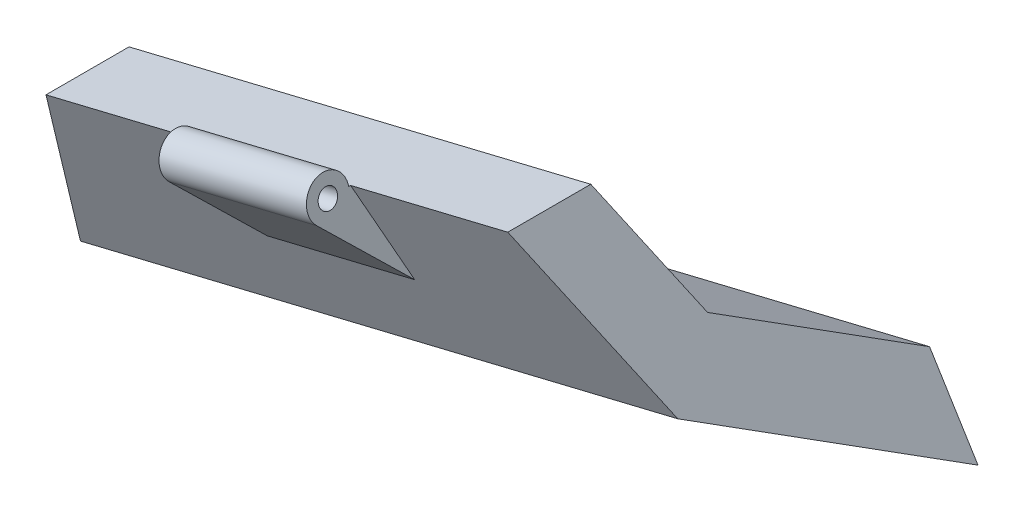
ISO-10303-21;
HEADER;
FILE_DESCRIPTION(('STEP AP214'),'2;1');
FILE_NAME('part.step','',(''),(''),'','','');
FILE_SCHEMA(('AUTOMOTIVE_DESIGN { 1 0 10303 214 1 1 1 1 }'));
ENDSEC;
DATA;
#1=APPLICATION_CONTEXT('core data for automotive mechanical design processes');
#2=APPLICATION_PROTOCOL_DEFINITION('international standard','automotive_design',2000,#1);
#3=PRODUCT_CONTEXT('',#1,'mechanical');
#4=PRODUCT('Part','Part','',(#3));
#5=PRODUCT_RELATED_PRODUCT_CATEGORY('part','',(#4));
#6=PRODUCT_DEFINITION_FORMATION('','',#4);
#7=PRODUCT_DEFINITION_CONTEXT('part definition',#1,'design');
#8=PRODUCT_DEFINITION('design','',#6,#7);
#9=PRODUCT_DEFINITION_SHAPE('','',#8);
#10=(LENGTH_UNIT() NAMED_UNIT(*) SI_UNIT(.MILLI.,.METRE.));
#11=(NAMED_UNIT(*) PLANE_ANGLE_UNIT() SI_UNIT($,.RADIAN.));
#12=(NAMED_UNIT(*) SI_UNIT($,.STERADIAN.) SOLID_ANGLE_UNIT());
#13=UNCERTAINTY_MEASURE_WITH_UNIT(LENGTH_MEASURE(1.E-05),#10,'distance_accuracy_value','');
#14=(GEOMETRIC_REPRESENTATION_CONTEXT(3) GLOBAL_UNCERTAINTY_ASSIGNED_CONTEXT((#13)) GLOBAL_UNIT_ASSIGNED_CONTEXT((#10,
#11,#12)) REPRESENTATION_CONTEXT('',''));
#15=CARTESIAN_POINT('',(0.,0.,0.));
#16=DIRECTION('',(0.,0.,1.));
#17=DIRECTION('',(1.,0.,0.));
#18=AXIS2_PLACEMENT_3D('',#15,#16,#17);
#19=CARTESIAN_POINT('',(348.988907895351,-99.5064339704242,30.));
#20=DIRECTION('',(0.0957973074488384,-0.39529428620475,0.913545457642601));
#21=DIRECTION('',(-0.2151642753711,0.887845503330089,0.406736643075799));
#22=AXIS2_PLACEMENT_3D('',#19,#20,#21);
#23=PLANE('',#22);
#24=DIRECTION('',(-0.2151642753711,0.88784550333009,0.406736643075798));
#25=VECTOR('',#24,1.);
#26=CARTESIAN_POINT('',(367.352521584004,47.1024045626833,91.5124851891419));
#27=LINE('',#26,#25);
#28=CARTESIAN_POINT('',(397.527444009768,-77.4102225583484,34.4712006573125));
#29=VERTEX_POINT('',#28);
#30=CARTESIAN_POINT('',(394.602701121481,-65.3416771769953,40.));
#31=VERTEX_POINT('',#30);
#32=EDGE_CURVE('E143',#29,#31,#27,.T.);
#33=ORIENTED_EDGE('',*,*,#32,.F.);
#34=DIRECTION('',(0.971867897653577,0.23552662165967,0.));
#35=VECTOR('',#34,1.);
#36=CARTESIAN_POINT('',(378.090086056696,-82.1207549915418,34.4712006573125));
#37=LINE('',#36,#35);
#38=CARTESIAN_POINT('',(378.090086056696,-82.1207549915418,34.4712006573125));
#39=VERTEX_POINT('',#38);
#40=EDGE_CURVE('E162',#39,#29,#37,.T.);
#41=ORIENTED_EDGE('',*,*,#40,.F.);
#42=DIRECTION('',(-0.2151642753711,0.88784550333009,0.406736643075798));
#43=VECTOR('',#42,1.);
#44=CARTESIAN_POINT('',(347.915163630932,42.3918721294899,91.5124851891419));
#45=LINE('',#44,#43);
#46=CARTESIAN_POINT('',(375.165343168409,-70.0522096101887,40.));
#47=VERTEX_POINT('',#46);
#48=EDGE_CURVE('E160',#39,#47,#45,.T.);
#49=ORIENTED_EDGE('',*,*,#48,.T.);
#50=DIRECTION('',(-0.971867897653576,-0.235526621659671,0.));
#51=VECTOR('',#50,1.);
#52=CARTESIAN_POINT('',(405.380934216758,-62.7296340850072,40.));
#53=LINE('',#52,#51);
#54=CARTESIAN_POINT('',(354.443708943028,-75.0739790462969,40.));
#55=VERTEX_POINT('',#54);
#56=EDGE_CURVE('E63',#55,#47,#53,.F.);
#57=ORIENTED_EDGE('',*,*,#56,.F.);
#58=DIRECTION('',(-0.202349167688116,-0.906336798585831,-0.370956091559517));
#59=VECTOR('',#58,1.);
#60=CARTESIAN_POINT('',(348.988907895351,-99.5064339704242,30.));
#61=LINE('',#60,#59);
#62=CARTESIAN_POINT('',(348.988907895351,-99.5064339704242,30.));
#63=VERTEX_POINT('',#62);
#64=EDGE_CURVE('E172',#55,#63,#61,.T.);
#65=ORIENTED_EDGE('',*,*,#64,.T.);
#66=DIRECTION('',(-0.971867897653576,-0.235526621659671,0.));
#67=VECTOR('',#66,1.);
#68=CARTESIAN_POINT('',(433.239967620562,-79.0886719307119,30.));
#69=LINE('',#68,#67);
#70=CARTESIAN_POINT('',(427.7428007149,-80.4208788624522,30.));
#71=VERTEX_POINT('',#70);
#72=EDGE_CURVE('E181',#63,#71,#69,.F.);
#73=ORIENTED_EDGE('',*,*,#72,.T.);
#74=DIRECTION('',(0.484023872949946,-0.78345831018347,-0.389761422692135));
#75=VECTOR('',#74,1.);
#76=CARTESIAN_POINT('',(427.7428007149,-80.4208788624522,30.));
#77=LINE('',#76,#75);
#78=CARTESIAN_POINT('',(415.324335346862,-60.3199077408872,40.));
#79=VERTEX_POINT('',#78);
#80=EDGE_CURVE('E169',#79,#71,#77,.T.);
#81=ORIENTED_EDGE('',*,*,#80,.F.);
#82=EDGE_CURVE('E171',#31,#79,#53,.F.);
#83=ORIENTED_EDGE('',*,*,#82,.F.);
#84=EDGE_LOOP('',(#33,#41,#49,#57,#65,#73,#81,#83));
#85=FACE_BOUND('',#84,.T.);
#86=ADVANCED_FACE('F41',(#85),#23,.T.);
#87=CARTESIAN_POINT('',(354.443708943028,-75.0739790462969,-0.0100000000000031));
#88=DIRECTION('',(0.235526621659671,-0.971867897653576,0.));
#89=DIRECTION('',(0.971867897653576,0.235526621659671,0.));
#90=AXIS2_PLACEMENT_3D('',#87,#88,#89);
#91=PLANE('',#90);
#92=DIRECTION('',(0.971867897653576,0.235526621659671,0.));
#93=VECTOR('',#92,1.);
#94=CARTESIAN_POINT('',(343.69889336054,-77.677923595355,29.0536372149395));
#95=LINE('',#94,#93);
#96=CARTESIAN_POINT('',(415.324335346862,-60.3199077408872,29.0536372149395));
#97=VERTEX_POINT('',#96);
#98=CARTESIAN_POINT('',(354.443708943028,-75.0739790462969,29.0536372149395));
#99=VERTEX_POINT('',#98);
#100=EDGE_CURVE('E199',#97,#99,#95,.F.);
#101=ORIENTED_EDGE('',*,*,#100,.T.);
#102=DIRECTION('',(0.,0.,1.));
#103=VECTOR('',#102,1.);
#104=CARTESIAN_POINT('',(354.443708943028,-75.0739790462969,-0.0100000000000031));
#105=LINE('',#104,#103);
#106=EDGE_CURVE('E49',#99,#55,#105,.T.);
#107=ORIENTED_EDGE('',*,*,#106,.T.);
#108=ORIENTED_EDGE('',*,*,#56,.T.);
#109=DIRECTION('',(0.,0.,1.));
#110=VECTOR('',#109,1.);
#111=CARTESIAN_POINT('',(375.165343168409,-70.0522096101887,-2.98188135074108E-13));
#112=LINE('',#111,#110);
#113=CARTESIAN_POINT('',(375.165343168409,-70.0522096101887,40.25));
#114=VERTEX_POINT('',#113);
#115=EDGE_CURVE('E59',#47,#114,#112,.T.);
#116=ORIENTED_EDGE('',*,*,#115,.T.);
#117=DIRECTION('',(0.971867897653577,0.23552662165967,0.));
#118=VECTOR('',#117,1.);
#119=CARTESIAN_POINT('',(375.165343168409,-70.0522096101887,40.25));
#120=LINE('',#119,#118);
#121=CARTESIAN_POINT('',(394.602701121481,-65.3416771769953,40.25));
#122=VERTEX_POINT('',#121);
#123=EDGE_CURVE('E123',#114,#122,#120,.T.);
#124=ORIENTED_EDGE('',*,*,#123,.T.);
#125=DIRECTION('',(0.,0.,1.));
#126=VECTOR('',#125,1.);
#127=CARTESIAN_POINT('',(394.602701121481,-65.3416771769953,-2.98188135074108E-13));
#128=LINE('',#127,#126);
#129=EDGE_CURVE('E124',#31,#122,#128,.T.);
#130=ORIENTED_EDGE('',*,*,#129,.F.);
#131=ORIENTED_EDGE('',*,*,#82,.T.);
#132=DIRECTION('',(0.,0.,1.));
#133=VECTOR('',#132,1.);
#134=CARTESIAN_POINT('',(415.324335346862,-60.3199077408872,-0.0100000000000031));
#135=LINE('',#134,#133);
#136=EDGE_CURVE('E11',#97,#79,#135,.T.);
#137=ORIENTED_EDGE('',*,*,#136,.F.);
#138=EDGE_LOOP('',(#101,#107,#108,#116,#124,#130,#131,#137));
#139=FACE_BOUND('',#138,.T.);
#140=ADVANCED_FACE('F121',(#139),#91,.F.);
#141=CARTESIAN_POINT('',(415.324335346862,-60.3199077408872,-0.0100000000000031));
#142=DIRECTION('',(-0.850738203766929,-0.52558967707844,0.));
#143=DIRECTION('',(0.52558967707844,-0.850738203766929,0.));
#144=AXIS2_PLACEMENT_3D('',#141,#142,#143);
#145=PLANE('',#144);
#146=DIRECTION('',(0.272839638851336,-0.441627974055819,-0.854706536773193));
#147=VECTOR('',#146,1.);
#148=CARTESIAN_POINT('',(429.61081277159,-83.444509825978,4.14820323635418));
#149=LINE('',#148,#147);
#150=CARTESIAN_POINT('',(423.852746647789,-74.124298556678,22.1861128887238));
#151=VERTEX_POINT('',#150);
#152=CARTESIAN_POINT('',(430.935003267619,-85.5878918084759,0.));
#153=VERTEX_POINT('',#152);
#154=EDGE_CURVE('E184',#151,#153,#149,.T.);
#155=ORIENTED_EDGE('',*,*,#154,.F.);
#156=DIRECTION('',(0.484023872949946,-0.78345831018347,-0.389761422692135));
#157=VECTOR('',#156,1.);
#158=CARTESIAN_POINT('',(425.67772741439,-77.0782775387581,20.7165426056686));
#159=LINE('',#158,#157);
#160=EDGE_CURVE('E192',#97,#151,#159,.T.);
#161=ORIENTED_EDGE('',*,*,#160,.F.);
#162=ORIENTED_EDGE('',*,*,#136,.T.);
#163=ORIENTED_EDGE('',*,*,#80,.T.);
#164=DIRECTION('',(0.272839638851336,-0.441627974055819,-0.854706536773193));
#165=VECTOR('',#164,1.);
#166=CARTESIAN_POINT('',(434.274769227932,-90.9937561509262,9.53773795629766));
#167=LINE('',#166,#165);
#168=CARTESIAN_POINT('',(437.319408373058,-95.9219177005234,0.));
#169=VERTEX_POINT('',#168);
#170=EDGE_CURVE('E174',#71,#169,#167,.T.);
#171=ORIENTED_EDGE('',*,*,#170,.T.);
#172=DIRECTION('',(0.52558967707844,-0.850738203766929,0.));
#173=VECTOR('',#172,1.);
#174=CARTESIAN_POINT('',(381.406613666847,-5.41947328350372,0.));
#175=LINE('',#174,#173);
#176=EDGE_CURVE('E166',#153,#169,#175,.T.);
#177=ORIENTED_EDGE('',*,*,#176,.F.);
#178=EDGE_LOOP('',(#155,#161,#162,#163,#171,#177));
#179=FACE_BOUND('',#178,.T.);
#180=ADVANCED_FACE('F222',(#179),#145,.F.);
#181=CARTESIAN_POINT('',(344.782390589165,-118.347734243823,-0.0100000000000031));
#182=DIRECTION('',(0.975972004001197,-0.217895955460141,0.));
#183=DIRECTION('',(0.217895955460141,0.975972004001197,0.));
#184=AXIS2_PLACEMENT_3D('',#181,#182,#183);
#185=PLANE('',#184);
#186=DIRECTION('',(-0.117912940333481,-0.528140728596464,-0.840930383146851));
#187=VECTOR('',#186,1.);
#188=CARTESIAN_POINT('',(347.465534795954,-106.329734079507,19.135622260557));
#189=LINE('',#188,#187);
#190=CARTESIAN_POINT('',(344.782390589165,-118.347734243823,0.));
#191=VERTEX_POINT('',#190);
#192=EDGE_CURVE('E185',#63,#191,#189,.T.);
#193=ORIENTED_EDGE('',*,*,#192,.F.);
#194=ORIENTED_EDGE('',*,*,#64,.F.);
#195=ORIENTED_EDGE('',*,*,#106,.F.);
#196=DIRECTION('',(-0.202349167688116,-0.906336798585831,-0.370956091559517));
#197=VECTOR('',#196,1.);
#198=CARTESIAN_POINT('',(349.810570963652,-95.8261446796476,20.5599489229547));
#199=LINE('',#198,#197);
#200=CARTESIAN_POINT('',(350.697611054069,-91.8530269003582,22.1861128887238));
#201=VERTEX_POINT('',#200);
#202=EDGE_CURVE('E191',#99,#201,#199,.T.);
#203=ORIENTED_EDGE('',*,*,#202,.T.);
#204=DIRECTION('',(-0.117912940333481,-0.528140728596464,-0.840930383146851));
#205=VECTOR('',#204,1.);
#206=CARTESIAN_POINT('',(349.448666277806,-97.4471423744249,13.2789004465472));
#207=LINE('',#206,#205);
#208=CARTESIAN_POINT('',(347.586735459956,-105.78686739489,0.));
#209=VERTEX_POINT('',#208);
#210=EDGE_CURVE('E187',#201,#209,#207,.T.);
#211=ORIENTED_EDGE('',*,*,#210,.T.);
#212=DIRECTION('',(0.217895955460141,0.975972004001197,0.));
#213=VECTOR('',#212,1.);
#214=CARTESIAN_POINT('',(372.10561997367,4.0350189461836,0.));
#215=LINE('',#214,#213);
#216=EDGE_CURVE('E44',#191,#209,#215,.T.);
#217=ORIENTED_EDGE('',*,*,#216,.F.);
#218=EDGE_LOOP('',(#193,#194,#195,#203,#211,#217));
#219=FACE_BOUND('',#218,.T.);
#220=ADVANCED_FACE('F43',(#219),#185,.F.);
#221=CARTESIAN_POINT('',(390.17876648423,0.,0.));
#222=DIRECTION('',(0.,0.,1.));
#223=DIRECTION('',(1.,0.,0.));
#224=AXIS2_PLACEMENT_3D('',#221,#222,#223);
#225=PLANE('',#224);
#226=CARTESIAN_POINT('',(389.873266372813,-102.275486483905,0.));
#227=DIRECTION('',(0.,0.,1.));
#228=DIRECTION('',(1.,0.,0.));
#229=AXIS2_PLACEMENT_3D('',#226,#227,#228);
#230=CIRCLE('',#229,3.00000000000001);
#231=CARTESIAN_POINT('',(392.873266372813,-102.275486483905,0.));
#232=VERTEX_POINT('',#231);
#233=EDGE_CURVE('E163',#232,#232,#230,.T.);
#234=ORIENTED_EDGE('',*,*,#233,.T.);
#235=EDGE_LOOP('',(#234));
#236=FACE_BOUND('',#235,.T.);
#237=DIRECTION('',(0.971867897653576,0.235526621659671,0.));
#238=VECTOR('',#237,1.);
#239=CARTESIAN_POINT('',(437.319408373058,-95.9219177005234,0.));
#240=LINE('',#239,#238);
#241=EDGE_CURVE('E180',#191,#169,#240,.T.);
#242=ORIENTED_EDGE('',*,*,#241,.F.);
#243=ORIENTED_EDGE('',*,*,#216,.T.);
#244=DIRECTION('',(-0.971867897653576,-0.235526621659671,0.));
#245=VECTOR('',#244,1.);
#246=CARTESIAN_POINT('',(434.599781204727,-84.6997538539824,0.));
#247=LINE('',#246,#245);
#248=EDGE_CURVE('E170',#209,#153,#247,.F.);
#249=ORIENTED_EDGE('',*,*,#248,.T.);
#250=ORIENTED_EDGE('',*,*,#176,.T.);
#251=EDGE_LOOP('',(#242,#243,#249,#250));
#252=FACE_BOUND('',#251,.T.);
#253=ADVANCED_FACE('F211',(#236,#252),#225,.F.);
#254=CARTESIAN_POINT('',(435.27968799681,-87.5052948156176,-5.));
#255=DIRECTION('',(0.203972037624801,-0.841662288490572,0.5));
#256=DIRECTION('',(-0.117763310829836,0.485933948826788,0.866025403784438));
#257=AXIS2_PLACEMENT_3D('',#254,#255,#256);
#258=PLANE('',#257);
#259=ORIENTED_EDGE('',*,*,#248,.F.);
#260=ORIENTED_EDGE('',*,*,#210,.F.);
#261=DIRECTION('',(0.971867897653576,0.235526621659671,0.));
#262=VECTOR('',#261,1.);
#263=CARTESIAN_POINT('',(347.331823710925,-92.668706195939,22.1861128887238));
#264=LINE('',#263,#262);
#265=EDGE_CURVE('E194',#201,#151,#264,.T.);
#266=ORIENTED_EDGE('',*,*,#265,.T.);
#267=ORIENTED_EDGE('',*,*,#154,.T.);
#268=EDGE_LOOP('',(#259,#260,#266,#267));
#269=FACE_BOUND('',#268,.T.);
#270=ADVANCED_FACE('F217',(#269),#258,.F.);
#271=CARTESIAN_POINT('',(348.030934820862,-95.5534911083766,20.864545423574));
#272=DIRECTION('',(0.0957973074488384,-0.39529428620475,0.913545457642601));
#273=DIRECTION('',(-0.2151642753711,0.887845503330089,0.406736643075799));
#274=AXIS2_PLACEMENT_3D('',#271,#272,#273);
#275=PLANE('',#274);
#276=ORIENTED_EDGE('',*,*,#100,.F.);
#277=ORIENTED_EDGE('',*,*,#160,.T.);
#278=ORIENTED_EDGE('',*,*,#265,.F.);
#279=ORIENTED_EDGE('',*,*,#202,.F.);
#280=EDGE_LOOP('',(#276,#277,#278,#279));
#281=FACE_BOUND('',#280,.T.);
#282=ADVANCED_FACE('F262',(#281),#275,.F.);
#283=CARTESIAN_POINT('',(389.873266372813,-102.275486483905,15.));
#284=DIRECTION('',(0.,0.,-1.));
#285=DIRECTION('',(-1.,0.,0.));
#286=AXIS2_PLACEMENT_3D('',#283,#284,#285);
#287=CYLINDRICAL_SURFACE('',#286,3.00000000000001);
#288=ORIENTED_EDGE('',*,*,#233,.F.);
#289=EDGE_LOOP('',(#288));
#290=FACE_BOUND('',#289,.T.);
#291=CARTESIAN_POINT('',(389.873266372813,-102.275486483905,8.6602540378444));
#292=DIRECTION('',(0.203972037624801,-0.841662288490572,0.5));
#293=DIRECTION('',(0.117763310829836,-0.485933948826789,-0.866025403784439));
#294=AXIS2_PLACEMENT_3D('',#291,#292,#293);
#295=ELLIPSE('',#294,6.00000000000001,3.00000000000001);
#296=CARTESIAN_POINT('',(390.579846237792,-105.191090176866,3.46410161513776));
#297=VERTEX_POINT('',#296);
#298=EDGE_CURVE('E165',#297,#297,#295,.T.);
#299=ORIENTED_EDGE('',*,*,#298,.T.);
#300=EDGE_LOOP('',(#299));
#301=FACE_BOUND('',#300,.T.);
#302=ADVANCED_FACE('F256',(#290,#301),#287,.F.);
#303=CARTESIAN_POINT('',(437.319408373058,-95.9219177005234,0.));
#304=DIRECTION('',(0.203972037624801,-0.841662288490572,0.5));
#305=DIRECTION('',(-0.117763310829836,0.485933948826788,0.866025403784438));
#306=AXIS2_PLACEMENT_3D('',#303,#304,#305);
#307=PLANE('',#306);
#308=ORIENTED_EDGE('',*,*,#298,.F.);
#309=EDGE_LOOP('',(#308));
#310=FACE_BOUND('',#309,.T.);
#311=ORIENTED_EDGE('',*,*,#241,.T.);
#312=ORIENTED_EDGE('',*,*,#170,.F.);
#313=ORIENTED_EDGE('',*,*,#72,.F.);
#314=ORIENTED_EDGE('',*,*,#192,.T.);
#315=EDGE_LOOP('',(#311,#312,#313,#314));
#316=FACE_BOUND('',#315,.T.);
#317=ADVANCED_FACE('F228',(#310,#316),#307,.T.);
#318=CARTESIAN_POINT('',(362.263921171666,-16.8162833086846,101.666003408307));
#319=DIRECTION('',(-0.16654247132551,0.687214380848352,-0.707106781186553));
#320=DIRECTION('',(0.,0.717121903474636,0.696947756691214));
#321=AXIS2_PLACEMENT_3D('',#318,#319,#320);
#322=PLANE('',#321);
#323=ORIENTED_EDGE('',*,*,#40,.T.);
#324=DIRECTION('',(-0.166542471325512,0.687214380848363,0.707106781186542));
#325=VECTOR('',#324,1.);
#326=CARTESIAN_POINT('',(381.701279124738,-12.1057508754912,101.666003408307));
#327=LINE('',#326,#325);
#328=CARTESIAN_POINT('',(395.060692917626,-67.2315167243283,44.944543648263));
#329=VERTEX_POINT('',#328);
#330=EDGE_CURVE('E137',#29,#329,#327,.T.);
#331=ORIENTED_EDGE('',*,*,#330,.T.);
#332=DIRECTION('',(0.971867897653577,0.23552662165967,0.));
#333=VECTOR('',#332,1.);
#334=CARTESIAN_POINT('',(375.623334964554,-71.9420491575217,44.944543648263));
#335=LINE('',#334,#333);
#336=CARTESIAN_POINT('',(375.623334964554,-71.9420491575217,44.944543648263));
#337=VERTEX_POINT('',#336);
#338=EDGE_CURVE('E129',#337,#329,#335,.T.);
#339=ORIENTED_EDGE('',*,*,#338,.F.);
#340=DIRECTION('',(-0.166542471325512,0.687214380848363,0.707106781186542));
#341=VECTOR('',#340,1.);
#342=CARTESIAN_POINT('',(362.263921171666,-16.8162833086846,101.666003408307));
#343=LINE('',#342,#341);
#344=EDGE_CURVE('E153',#39,#337,#343,.T.);
#345=ORIENTED_EDGE('',*,*,#344,.F.);
#346=EDGE_LOOP('',(#323,#331,#339,#345));
#347=FACE_BOUND('',#346,.T.);
#348=ADVANCED_FACE('F235',(#347),#322,.F.);
#349=CARTESIAN_POINT('',(375.165343168409,-70.0522096101887,43.));
#350=DIRECTION('',(0.971867897653577,0.23552662165967,0.));
#351=DIRECTION('',(-0.23552662165967,0.971867897653577,0.));
#352=AXIS2_PLACEMENT_3D('',#349,#350,#351);
#353=CYLINDRICAL_SURFACE('',#352,2.75000000000001);
#354=ORIENTED_EDGE('',*,*,#338,.T.);
#355=CARTESIAN_POINT('',(394.602701121481,-65.3416771769953,43.));
#356=DIRECTION('',(0.971867897653576,0.235526621659671,0.));
#357=DIRECTION('',(-0.235526621659671,0.971867897653576,0.));
#358=AXIS2_PLACEMENT_3D('',#355,#356,#357);
#359=CIRCLE('',#358,2.75000000000001);
#360=EDGE_CURVE('E133',#122,#329,#359,.T.);
#361=ORIENTED_EDGE('',*,*,#360,.F.);
#362=ORIENTED_EDGE('',*,*,#123,.F.);
#363=CARTESIAN_POINT('',(375.165343168409,-70.0522096101887,43.));
#364=DIRECTION('',(0.971867897653576,0.235526621659671,0.));
#365=DIRECTION('',(-0.235526621659671,0.971867897653576,0.));
#366=AXIS2_PLACEMENT_3D('',#363,#364,#365);
#367=CIRCLE('',#366,2.75000000000001);
#368=EDGE_CURVE('E155',#114,#337,#367,.T.);
#369=ORIENTED_EDGE('',*,*,#368,.T.);
#370=EDGE_LOOP('',(#354,#361,#362,#369));
#371=FACE_BOUND('',#370,.T.);
#372=ADVANCED_FACE('F132',(#371),#353,.T.);
#373=CARTESIAN_POINT('',(375.165343168409,-70.0522096101887,43.));
#374=DIRECTION('',(0.971867897653577,0.23552662165967,0.));
#375=DIRECTION('',(-0.23552662165967,0.971867897653577,0.));
#376=AXIS2_PLACEMENT_3D('',#373,#374,#375);
#377=CYLINDRICAL_SURFACE('',#376,1.24999999999999);
#378=CARTESIAN_POINT('',(375.165343168409,-70.0522096101887,43.));
#379=DIRECTION('',(0.971867897653576,0.235526621659671,0.));
#380=DIRECTION('',(-0.235526621659671,0.971867897653576,0.));
#381=AXIS2_PLACEMENT_3D('',#378,#379,#380);
#382=CIRCLE('',#381,1.24999999999999);
#383=CARTESIAN_POINT('',(374.870934891335,-68.8373747381218,43.));
#384=VERTEX_POINT('',#383);
#385=EDGE_CURVE('E127',#384,#384,#382,.T.);
#386=ORIENTED_EDGE('',*,*,#385,.F.);
#387=EDGE_LOOP('',(#386));
#388=FACE_BOUND('',#387,.T.);
#389=CARTESIAN_POINT('',(394.602701121481,-65.3416771769953,43.));
#390=DIRECTION('',(0.971867897653576,0.235526621659671,0.));
#391=DIRECTION('',(-0.235526621659671,0.971867897653576,0.));
#392=AXIS2_PLACEMENT_3D('',#389,#390,#391);
#393=CIRCLE('',#392,1.24999999999999);
#394=CARTESIAN_POINT('',(394.308292844406,-64.1268423049283,43.));
#395=VERTEX_POINT('',#394);
#396=EDGE_CURVE('E146',#395,#395,#393,.T.);
#397=ORIENTED_EDGE('',*,*,#396,.T.);
#398=EDGE_LOOP('',(#397));
#399=FACE_BOUND('',#398,.T.);
#400=ADVANCED_FACE('F237',(#388,#399),#377,.F.);
#401=CARTESIAN_POINT('',(338.318870851267,81.9896416865871,-2.98188135074108E-13));
#402=DIRECTION('',(0.971867897653576,0.235526621659671,0.));
#403=DIRECTION('',(-0.235526621659671,0.971867897653576,0.));
#404=AXIS2_PLACEMENT_3D('',#401,#402,#403);
#405=PLANE('',#404);
#406=ORIENTED_EDGE('',*,*,#115,.F.);
#407=ORIENTED_EDGE('',*,*,#48,.F.);
#408=ORIENTED_EDGE('',*,*,#344,.T.);
#409=ORIENTED_EDGE('',*,*,#368,.F.);
#410=EDGE_LOOP('',(#406,#407,#408,#409));
#411=FACE_BOUND('',#410,.T.);
#412=ORIENTED_EDGE('',*,*,#385,.T.);
#413=EDGE_LOOP('',(#412));
#414=FACE_BOUND('',#413,.T.);
#415=ADVANCED_FACE('F232',(#411,#414),#405,.F.);
#416=CARTESIAN_POINT('',(357.756228804339,86.7001741197805,-2.98188135074108E-13));
#417=DIRECTION('',(0.971867897653576,0.235526621659671,0.));
#418=DIRECTION('',(-0.235526621659671,0.971867897653576,0.));
#419=AXIS2_PLACEMENT_3D('',#416,#417,#418);
#420=PLANE('',#419);
#421=ORIENTED_EDGE('',*,*,#129,.T.);
#422=ORIENTED_EDGE('',*,*,#360,.T.);
#423=ORIENTED_EDGE('',*,*,#330,.F.);
#424=ORIENTED_EDGE('',*,*,#32,.T.);
#425=EDGE_LOOP('',(#421,#422,#423,#424));
#426=FACE_BOUND('',#425,.T.);
#427=ORIENTED_EDGE('',*,*,#396,.F.);
#428=EDGE_LOOP('',(#427));
#429=FACE_BOUND('',#428,.T.);
#430=ADVANCED_FACE('F141',(#426,#429),#420,.T.);
#431=CLOSED_SHELL('',(#86,#140,#180,#220,#253,#270,#282,#302,#317,#348,#372,#400,#415,#430));
#432=MANIFOLD_SOLID_BREP('B2',#431);
#433=ADVANCED_BREP_SHAPE_REPRESENTATION('',(#18,#432),#14);
#434=SHAPE_DEFINITION_REPRESENTATION(#9,#433);
ENDSEC;
END-ISO-10303-21;
